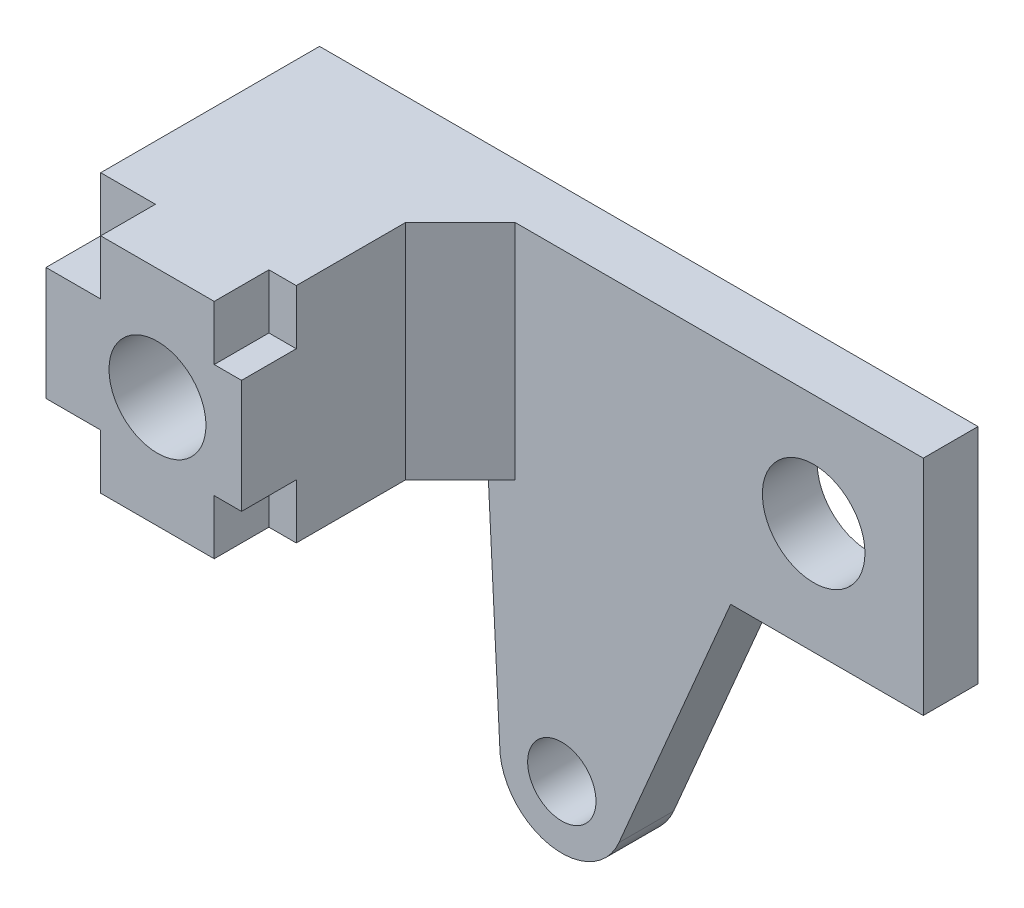
ISO-10303-21;
HEADER;
FILE_DESCRIPTION(('STEP AP214'),'2;1');
FILE_NAME('part.step','',(''),(''),'','','');
FILE_SCHEMA(('AUTOMOTIVE_DESIGN { 1 0 10303 214 1 1 1 1 }'));
ENDSEC;
DATA;
#1=APPLICATION_CONTEXT('core data for automotive mechanical design processes');
#2=APPLICATION_PROTOCOL_DEFINITION('international standard','automotive_design',2000,#1);
#3=PRODUCT_CONTEXT('',#1,'mechanical');
#4=PRODUCT('Part','Part','',(#3));
#5=PRODUCT_RELATED_PRODUCT_CATEGORY('part','',(#4));
#6=PRODUCT_DEFINITION_FORMATION('','',#4);
#7=PRODUCT_DEFINITION_CONTEXT('part definition',#1,'design');
#8=PRODUCT_DEFINITION('design','',#6,#7);
#9=PRODUCT_DEFINITION_SHAPE('','',#8);
#10=(LENGTH_UNIT() NAMED_UNIT(*) SI_UNIT(.MILLI.,.METRE.));
#11=(NAMED_UNIT(*) PLANE_ANGLE_UNIT() SI_UNIT($,.RADIAN.));
#12=(NAMED_UNIT(*) SI_UNIT($,.STERADIAN.) SOLID_ANGLE_UNIT());
#13=UNCERTAINTY_MEASURE_WITH_UNIT(LENGTH_MEASURE(1.E-05),#10,'distance_accuracy_value','');
#14=(GEOMETRIC_REPRESENTATION_CONTEXT(3) GLOBAL_UNCERTAINTY_ASSIGNED_CONTEXT((#13)) GLOBAL_UNIT_ASSIGNED_CONTEXT((#10,
#11,#12)) REPRESENTATION_CONTEXT('',''));
#15=CARTESIAN_POINT('',(0.,0.,0.));
#16=DIRECTION('',(0.,0.,1.));
#17=DIRECTION('',(1.,0.,0.));
#18=AXIS2_PLACEMENT_3D('',#15,#16,#17);
#19=CARTESIAN_POINT('',(0.,0.,-50.8));
#20=DIRECTION('',(0.,1.,0.));
#21=DIRECTION('',(0.,0.,-1.));
#22=AXIS2_PLACEMENT_3D('',#19,#20,#21);
#23=PLANE('',#22);
#24=DIRECTION('',(0.,0.,-1.));
#25=VECTOR('',#24,1.);
#26=CARTESIAN_POINT('',(20.701,0.,-45.72));
#27=LINE('',#26,#25);
#28=CARTESIAN_POINT('',(20.701,0.,-45.72));
#29=VERTEX_POINT('',#28);
#30=CARTESIAN_POINT('',(20.701,0.,-50.8));
#31=VERTEX_POINT('',#30);
#32=EDGE_CURVE('E277',#29,#31,#27,.T.);
#33=ORIENTED_EDGE('',*,*,#32,.F.);
#34=DIRECTION('',(-1.,0.,0.));
#35=VECTOR('',#34,1.);
#36=CARTESIAN_POINT('',(0.,0.,-45.72));
#37=LINE('',#36,#35);
#38=CARTESIAN_POINT('',(23.241,0.,-45.72));
#39=VERTEX_POINT('',#38);
#40=EDGE_CURVE('E46',#39,#29,#37,.T.);
#41=ORIENTED_EDGE('',*,*,#40,.F.);
#42=DIRECTION('',(0.707106781186548,0.,-0.707106781186548));
#43=VECTOR('',#42,1.);
#44=CARTESIAN_POINT('',(-11.2395,0.,-11.2395));
#45=LINE('',#44,#43);
#46=CARTESIAN_POINT('',(18.161,0.,-40.64));
#47=VERTEX_POINT('',#46);
#48=EDGE_CURVE('E280',#47,#39,#45,.T.);
#49=ORIENTED_EDGE('',*,*,#48,.F.);
#50=DIRECTION('',(0.,0.,-1.));
#51=VECTOR('',#50,1.);
#52=CARTESIAN_POINT('',(18.161,0.,-40.64));
#53=LINE('',#52,#51);
#54=CARTESIAN_POINT('',(18.161,0.,-30.48));
#55=VERTEX_POINT('',#54);
#56=EDGE_CURVE('E287',#55,#47,#53,.T.);
#57=ORIENTED_EDGE('',*,*,#56,.F.);
#58=DIRECTION('',(-1.,0.,0.));
#59=VECTOR('',#58,1.);
#60=CARTESIAN_POINT('',(20.701,0.,-30.48));
#61=LINE('',#60,#59);
#62=CARTESIAN_POINT('',(15.621,0.,-30.48));
#63=VERTEX_POINT('',#62);
#64=EDGE_CURVE('E345',#55,#63,#61,.T.);
#65=ORIENTED_EDGE('',*,*,#64,.T.);
#66=DIRECTION('',(0.,0.,1.));
#67=VECTOR('',#66,1.);
#68=CARTESIAN_POINT('',(15.621,0.,-30.48));
#69=LINE('',#68,#67);
#70=CARTESIAN_POINT('',(15.621,0.,-25.4));
#71=VERTEX_POINT('',#70);
#72=EDGE_CURVE('E339',#63,#71,#69,.T.);
#73=ORIENTED_EDGE('',*,*,#72,.T.);
#74=DIRECTION('',(1.,0.,0.));
#75=VECTOR('',#74,1.);
#76=CARTESIAN_POINT('',(0.,0.,-25.4));
#77=LINE('',#76,#75);
#78=CARTESIAN_POINT('',(5.08,0.,-25.4));
#79=VERTEX_POINT('',#78);
#80=EDGE_CURVE('E222',#79,#71,#77,.T.);
#81=ORIENTED_EDGE('',*,*,#80,.F.);
#82=DIRECTION('',(0.,0.,1.));
#83=VECTOR('',#82,1.);
#84=CARTESIAN_POINT('',(5.08,0.,-30.48));
#85=LINE('',#84,#83);
#86=CARTESIAN_POINT('',(5.08,0.,-30.48));
#87=VERTEX_POINT('',#86);
#88=EDGE_CURVE('E372',#87,#79,#85,.T.);
#89=ORIENTED_EDGE('',*,*,#88,.F.);
#90=DIRECTION('',(-1.,0.,0.));
#91=VECTOR('',#90,1.);
#92=CARTESIAN_POINT('',(0.,0.,-30.48));
#93=LINE('',#92,#91);
#94=CARTESIAN_POINT('',(0.,0.,-30.48));
#95=VERTEX_POINT('',#94);
#96=EDGE_CURVE('E369',#87,#95,#93,.T.);
#97=ORIENTED_EDGE('',*,*,#96,.T.);
#98=DIRECTION('',(0.,0.,1.));
#99=VECTOR('',#98,1.);
#100=CARTESIAN_POINT('',(0.,0.,-50.8));
#101=LINE('',#100,#99);
#102=CARTESIAN_POINT('',(0.,0.,-50.8));
#103=VERTEX_POINT('',#102);
#104=EDGE_CURVE('E225',#103,#95,#101,.T.);
#105=ORIENTED_EDGE('',*,*,#104,.F.);
#106=DIRECTION('',(1.,0.,0.));
#107=VECTOR('',#106,1.);
#108=CARTESIAN_POINT('',(0.,0.,-50.8));
#109=LINE('',#108,#107);
#110=EDGE_CURVE('E230',#103,#31,#109,.T.);
#111=ORIENTED_EDGE('',*,*,#110,.T.);
#112=EDGE_LOOP('',(#33,#41,#49,#57,#65,#73,#81,#89,#97,#105,#111));
#113=FACE_BOUND('',#112,.T.);
#114=ADVANCED_FACE('F38',(#113),#23,.F.);
#115=CARTESIAN_POINT('',(43.2595043201598,0.,-50.8));
#116=VERTEX_POINT('',#115);
#117=CARTESIAN_POINT('',(61.1505,0.,-50.8));
#118=VERTEX_POINT('',#117);
#119=EDGE_CURVE('E229',#116,#118,#109,.T.);
#120=ORIENTED_EDGE('',*,*,#119,.T.);
#121=DIRECTION('',(0.,0.,-1.));
#122=VECTOR('',#121,1.);
#123=CARTESIAN_POINT('',(61.1505,0.,-50.8));
#124=LINE('',#123,#122);
#125=CARTESIAN_POINT('',(61.1505,0.,-45.72));
#126=VERTEX_POINT('',#125);
#127=EDGE_CURVE('E194',#126,#118,#124,.T.);
#128=ORIENTED_EDGE('',*,*,#127,.F.);
#129=DIRECTION('',(-1.,0.,0.));
#130=VECTOR('',#129,1.);
#131=CARTESIAN_POINT('',(0.,0.,-45.72));
#132=LINE('',#131,#130);
#133=CARTESIAN_POINT('',(43.2595043201598,0.,-45.72));
#134=VERTEX_POINT('',#133);
#135=EDGE_CURVE('E233',#126,#134,#132,.T.);
#136=ORIENTED_EDGE('',*,*,#135,.T.);
#137=DIRECTION('',(0.,0.,-1.));
#138=VECTOR('',#137,1.);
#139=CARTESIAN_POINT('',(43.2595043201598,0.,-45.72));
#140=LINE('',#139,#138);
#141=EDGE_CURVE('E275',#134,#116,#140,.T.);
#142=ORIENTED_EDGE('',*,*,#141,.T.);
#143=EDGE_LOOP('',(#120,#128,#136,#142));
#144=FACE_BOUND('',#143,.T.);
#145=ADVANCED_FACE('F452',(#144),#23,.F.);
#146=CARTESIAN_POINT('',(0.,20.701,-50.8));
#147=DIRECTION('',(0.,1.,0.));
#148=DIRECTION('',(0.,0.,-1.));
#149=AXIS2_PLACEMENT_3D('',#146,#147,#148);
#150=PLANE('',#149);
#151=DIRECTION('',(0.,0.,-1.));
#152=VECTOR('',#151,1.);
#153=CARTESIAN_POINT('',(61.1505,20.701,-50.8));
#154=LINE('',#153,#152);
#155=CARTESIAN_POINT('',(61.1505,20.701,-45.72));
#156=VERTEX_POINT('',#155);
#157=CARTESIAN_POINT('',(61.1505,20.701,-50.8));
#158=VERTEX_POINT('',#157);
#159=EDGE_CURVE('E53',#156,#158,#154,.T.);
#160=ORIENTED_EDGE('',*,*,#159,.T.);
#161=DIRECTION('',(1.,0.,0.));
#162=VECTOR('',#161,1.);
#163=CARTESIAN_POINT('',(0.,20.701,-50.8));
#164=LINE('',#163,#162);
#165=CARTESIAN_POINT('',(0.,20.701,-50.8));
#166=VERTEX_POINT('',#165);
#167=EDGE_CURVE('E205',#166,#158,#164,.T.);
#168=ORIENTED_EDGE('',*,*,#167,.F.);
#169=DIRECTION('',(0.,0.,1.));
#170=VECTOR('',#169,1.);
#171=CARTESIAN_POINT('',(0.,20.701,-50.8));
#172=LINE('',#171,#170);
#173=CARTESIAN_POINT('',(0.,20.701,-30.48));
#174=VERTEX_POINT('',#173);
#175=EDGE_CURVE('E215',#166,#174,#172,.T.);
#176=ORIENTED_EDGE('',*,*,#175,.T.);
#177=DIRECTION('',(1.,0.,0.));
#178=VECTOR('',#177,1.);
#179=CARTESIAN_POINT('',(0.,20.701,-30.48));
#180=LINE('',#179,#178);
#181=CARTESIAN_POINT('',(5.08,20.701,-30.48));
#182=VERTEX_POINT('',#181);
#183=EDGE_CURVE('E307',#174,#182,#180,.T.);
#184=ORIENTED_EDGE('',*,*,#183,.T.);
#185=DIRECTION('',(0.,0.,1.));
#186=VECTOR('',#185,1.);
#187=CARTESIAN_POINT('',(5.08,20.701,-30.48));
#188=LINE('',#187,#186);
#189=CARTESIAN_POINT('',(5.08,20.701,-25.4));
#190=VERTEX_POINT('',#189);
#191=EDGE_CURVE('E325',#182,#190,#188,.T.);
#192=ORIENTED_EDGE('',*,*,#191,.T.);
#193=DIRECTION('',(1.,0.,0.));
#194=VECTOR('',#193,1.);
#195=CARTESIAN_POINT('',(0.,20.701,-25.4));
#196=LINE('',#195,#194);
#197=CARTESIAN_POINT('',(15.621,20.701,-25.4));
#198=VERTEX_POINT('',#197);
#199=EDGE_CURVE('E218',#190,#198,#196,.T.);
#200=ORIENTED_EDGE('',*,*,#199,.T.);
#201=DIRECTION('',(0.,0.,1.));
#202=VECTOR('',#201,1.);
#203=CARTESIAN_POINT('',(15.621,20.701,-30.48));
#204=LINE('',#203,#202);
#205=CARTESIAN_POINT('',(15.621,20.701,-30.48));
#206=VERTEX_POINT('',#205);
#207=EDGE_CURVE('E336',#206,#198,#204,.T.);
#208=ORIENTED_EDGE('',*,*,#207,.F.);
#209=DIRECTION('',(1.,0.,0.));
#210=VECTOR('',#209,1.);
#211=CARTESIAN_POINT('',(20.701,20.701,-30.48));
#212=LINE('',#211,#210);
#213=CARTESIAN_POINT('',(18.161,20.701,-30.48));
#214=VERTEX_POINT('',#213);
#215=EDGE_CURVE('E334',#206,#214,#212,.T.);
#216=ORIENTED_EDGE('',*,*,#215,.T.);
#217=DIRECTION('',(0.,0.,-1.));
#218=VECTOR('',#217,1.);
#219=CARTESIAN_POINT('',(18.161,20.701,-40.64));
#220=LINE('',#219,#218);
#221=CARTESIAN_POINT('',(18.161,20.701,-40.64));
#222=VERTEX_POINT('',#221);
#223=EDGE_CURVE('E288',#214,#222,#220,.T.);
#224=ORIENTED_EDGE('',*,*,#223,.T.);
#225=DIRECTION('',(0.707106781186548,0.,-0.707106781186548));
#226=VECTOR('',#225,1.);
#227=CARTESIAN_POINT('',(-11.2395,20.701,-11.2395));
#228=LINE('',#227,#226);
#229=CARTESIAN_POINT('',(23.241,20.701,-45.72));
#230=VERTEX_POINT('',#229);
#231=EDGE_CURVE('E274',#222,#230,#228,.T.);
#232=ORIENTED_EDGE('',*,*,#231,.T.);
#233=DIRECTION('',(-1.,0.,0.));
#234=VECTOR('',#233,1.);
#235=CARTESIAN_POINT('',(0.,20.701,-45.72));
#236=LINE('',#235,#234);
#237=EDGE_CURVE('E208',#156,#230,#236,.T.);
#238=ORIENTED_EDGE('',*,*,#237,.F.);
#239=EDGE_LOOP('',(#160,#168,#176,#184,#192,#200,#208,#216,#224,#232,#238));
#240=FACE_BOUND('',#239,.T.);
#241=ADVANCED_FACE('F203',(#240),#150,.T.);
#242=CARTESIAN_POINT('',(0.,20.701,-25.4));
#243=DIRECTION('',(0.,0.,1.));
#244=DIRECTION('',(-1.,0.,0.));
#245=AXIS2_PLACEMENT_3D('',#242,#243,#244);
#246=PLANE('',#245);
#247=DIRECTION('',(0.,-1.,0.));
#248=VECTOR('',#247,1.);
#249=CARTESIAN_POINT('',(18.161,20.701,-25.4));
#250=LINE('',#249,#248);
#251=CARTESIAN_POINT('',(18.161,15.621,-25.4));
#252=VERTEX_POINT('',#251);
#253=CARTESIAN_POINT('',(18.161,5.08,-25.4));
#254=VERTEX_POINT('',#253);
#255=EDGE_CURVE('E297',#252,#254,#250,.T.);
#256=ORIENTED_EDGE('',*,*,#255,.F.);
#257=DIRECTION('',(-1.,0.,0.));
#258=VECTOR('',#257,1.);
#259=CARTESIAN_POINT('',(20.701,15.621,-25.4));
#260=LINE('',#259,#258);
#261=CARTESIAN_POINT('',(15.621,15.621,-25.4));
#262=VERTEX_POINT('',#261);
#263=EDGE_CURVE('E337',#252,#262,#260,.T.);
#264=ORIENTED_EDGE('',*,*,#263,.T.);
#265=DIRECTION('',(0.,1.,0.));
#266=VECTOR('',#265,1.);
#267=CARTESIAN_POINT('',(15.621,20.701,-25.4));
#268=LINE('',#267,#266);
#269=EDGE_CURVE('E332',#262,#198,#268,.T.);
#270=ORIENTED_EDGE('',*,*,#269,.T.);
#271=ORIENTED_EDGE('',*,*,#199,.F.);
#272=DIRECTION('',(0.,-1.,0.));
#273=VECTOR('',#272,1.);
#274=CARTESIAN_POINT('',(5.08,20.701,-25.4));
#275=LINE('',#274,#273);
#276=CARTESIAN_POINT('',(5.08,15.621,-25.4));
#277=VERTEX_POINT('',#276);
#278=EDGE_CURVE('E316',#190,#277,#275,.T.);
#279=ORIENTED_EDGE('',*,*,#278,.T.);
#280=DIRECTION('',(-1.,0.,0.));
#281=VECTOR('',#280,1.);
#282=CARTESIAN_POINT('',(0.,15.621,-25.4));
#283=LINE('',#282,#281);
#284=CARTESIAN_POINT('',(0.,15.621,-25.4));
#285=VERTEX_POINT('',#284);
#286=EDGE_CURVE('E308',#277,#285,#283,.T.);
#287=ORIENTED_EDGE('',*,*,#286,.T.);
#288=DIRECTION('',(0.,-1.,0.));
#289=VECTOR('',#288,1.);
#290=CARTESIAN_POINT('',(0.,20.701,-25.4));
#291=LINE('',#290,#289);
#292=CARTESIAN_POINT('',(0.,5.08,-25.4));
#293=VERTEX_POINT('',#292);
#294=EDGE_CURVE('E236',#285,#293,#291,.T.);
#295=ORIENTED_EDGE('',*,*,#294,.T.);
#296=DIRECTION('',(1.,0.,0.));
#297=VECTOR('',#296,1.);
#298=CARTESIAN_POINT('',(0.,5.08,-25.4));
#299=LINE('',#298,#297);
#300=CARTESIAN_POINT('',(5.08,5.08,-25.4));
#301=VERTEX_POINT('',#300);
#302=EDGE_CURVE('E328',#293,#301,#299,.T.);
#303=ORIENTED_EDGE('',*,*,#302,.T.);
#304=DIRECTION('',(0.,-1.,0.));
#305=VECTOR('',#304,1.);
#306=CARTESIAN_POINT('',(5.08,0.,-25.4));
#307=LINE('',#306,#305);
#308=EDGE_CURVE('E365',#301,#79,#307,.T.);
#309=ORIENTED_EDGE('',*,*,#308,.T.);
#310=ORIENTED_EDGE('',*,*,#80,.T.);
#311=DIRECTION('',(0.,1.,0.));
#312=VECTOR('',#311,1.);
#313=CARTESIAN_POINT('',(15.621,0.,-25.4));
#314=LINE('',#313,#312);
#315=CARTESIAN_POINT('',(15.621,5.08,-25.4));
#316=VERTEX_POINT('',#315);
#317=EDGE_CURVE('E303',#71,#316,#314,.T.);
#318=ORIENTED_EDGE('',*,*,#317,.T.);
#319=DIRECTION('',(1.,0.,0.));
#320=VECTOR('',#319,1.);
#321=CARTESIAN_POINT('',(20.701,5.08,-25.4));
#322=LINE('',#321,#320);
#323=EDGE_CURVE('E348',#316,#254,#322,.T.);
#324=ORIENTED_EDGE('',*,*,#323,.T.);
#325=EDGE_LOOP('',(#256,#264,#270,#271,#279,#287,#295,#303,#309,#310,#318,#324));
#326=FACE_BOUND('',#325,.T.);
#327=CARTESIAN_POINT('',(10.3505,10.3505,-25.4));
#328=DIRECTION('',(0.,0.,-1.));
#329=DIRECTION('',(-1.,0.,0.));
#330=AXIS2_PLACEMENT_3D('',#327,#328,#329);
#331=CIRCLE('',#330,4.5);
#332=CARTESIAN_POINT('',(5.8505,10.3505,-25.4));
#333=VERTEX_POINT('',#332);
#334=EDGE_CURVE('E242',#333,#333,#331,.T.);
#335=ORIENTED_EDGE('',*,*,#334,.T.);
#336=EDGE_LOOP('',(#335));
#337=FACE_BOUND('',#336,.T.);
#338=ADVANCED_FACE('F40',(#326,#337),#246,.T.);
#339=CARTESIAN_POINT('',(0.,20.701,-50.8));
#340=DIRECTION('',(-1.,0.,0.));
#341=DIRECTION('',(0.,0.,-1.));
#342=AXIS2_PLACEMENT_3D('',#339,#340,#341);
#343=PLANE('',#342);
#344=ORIENTED_EDGE('',*,*,#294,.F.);
#345=DIRECTION('',(0.,0.,1.));
#346=VECTOR('',#345,1.);
#347=CARTESIAN_POINT('',(0.,15.621,-30.48));
#348=LINE('',#347,#346);
#349=CARTESIAN_POINT('',(0.,15.621,-30.48));
#350=VERTEX_POINT('',#349);
#351=EDGE_CURVE('E315',#350,#285,#348,.T.);
#352=ORIENTED_EDGE('',*,*,#351,.F.);
#353=DIRECTION('',(0.,1.,0.));
#354=VECTOR('',#353,1.);
#355=CARTESIAN_POINT('',(0.,20.701,-30.48));
#356=LINE('',#355,#354);
#357=EDGE_CURVE('E304',#350,#174,#356,.T.);
#358=ORIENTED_EDGE('',*,*,#357,.T.);
#359=ORIENTED_EDGE('',*,*,#175,.F.);
#360=DIRECTION('',(0.,-1.,0.));
#361=VECTOR('',#360,1.);
#362=CARTESIAN_POINT('',(0.,20.701,-50.8));
#363=LINE('',#362,#361);
#364=EDGE_CURVE('E213',#166,#103,#363,.T.);
#365=ORIENTED_EDGE('',*,*,#364,.T.);
#366=ORIENTED_EDGE('',*,*,#104,.T.);
#367=DIRECTION('',(0.,1.,0.));
#368=VECTOR('',#367,1.);
#369=CARTESIAN_POINT('',(0.,0.,-30.48));
#370=LINE('',#369,#368);
#371=CARTESIAN_POINT('',(0.,5.08,-30.48));
#372=VERTEX_POINT('',#371);
#373=EDGE_CURVE('E361',#95,#372,#370,.T.);
#374=ORIENTED_EDGE('',*,*,#373,.T.);
#375=DIRECTION('',(0.,0.,1.));
#376=VECTOR('',#375,1.);
#377=CARTESIAN_POINT('',(0.,5.08,-30.48));
#378=LINE('',#377,#376);
#379=EDGE_CURVE('E380',#372,#293,#378,.T.);
#380=ORIENTED_EDGE('',*,*,#379,.T.);
#381=EDGE_LOOP('',(#344,#352,#358,#359,#365,#366,#374,#380));
#382=FACE_BOUND('',#381,.T.);
#383=ADVANCED_FACE('F443',(#382),#343,.T.);
#384=CARTESIAN_POINT('',(0.,20.701,-50.8));
#385=DIRECTION('',(0.,0.,1.));
#386=DIRECTION('',(-1.,0.,0.));
#387=AXIS2_PLACEMENT_3D('',#384,#385,#386);
#388=PLANE('',#387);
#389=CARTESIAN_POINT('',(50.970999912,10.3505,-50.8));
#390=DIRECTION('',(0.,0.,1.));
#391=DIRECTION('',(1.,0.,0.));
#392=AXIS2_PLACEMENT_3D('',#389,#390,#391);
#393=CIRCLE('',#392,4.7625);
#394=CARTESIAN_POINT('',(55.733499912,10.3505,-50.8));
#395=VERTEX_POINT('',#394);
#396=EDGE_CURVE('E243',#395,#395,#393,.T.);
#397=ORIENTED_EDGE('',*,*,#396,.T.);
#398=EDGE_LOOP('',(#397));
#399=FACE_BOUND('',#398,.T.);
#400=CARTESIAN_POINT('',(10.3505,10.3505,-50.8));
#401=DIRECTION('',(0.,0.,-1.));
#402=DIRECTION('',(-1.,0.,0.));
#403=AXIS2_PLACEMENT_3D('',#400,#401,#402);
#404=CIRCLE('',#403,4.5);
#405=CARTESIAN_POINT('',(5.8505,10.3505,-50.8));
#406=VERTEX_POINT('',#405);
#407=EDGE_CURVE('E226',#406,#406,#404,.T.);
#408=ORIENTED_EDGE('',*,*,#407,.F.);
#409=EDGE_LOOP('',(#408));
#410=FACE_BOUND('',#409,.T.);
#411=ORIENTED_EDGE('',*,*,#167,.T.);
#412=DIRECTION('',(0.,-1.,0.));
#413=VECTOR('',#412,1.);
#414=CARTESIAN_POINT('',(61.1505,20.701,-50.8));
#415=LINE('',#414,#413);
#416=EDGE_CURVE('E191',#158,#118,#415,.T.);
#417=ORIENTED_EDGE('',*,*,#416,.T.);
#418=ORIENTED_EDGE('',*,*,#119,.F.);
#419=DIRECTION('',(0.391880007881832,0.920016336497638,0.));
#420=VECTOR('',#419,1.);
#421=CARTESIAN_POINT('',(36.6161448123023,-15.5966090474787,-50.8));
#422=LINE('',#421,#420);
#423=CARTESIAN_POINT('',(32.8846235947898,-24.3570980008583,-50.8));
#424=VERTEX_POINT('',#423);
#425=EDGE_CURVE('E60',#424,#116,#422,.T.);
#426=ORIENTED_EDGE('',*,*,#425,.F.);
#427=CARTESIAN_POINT('',(27.580941282,-22.098,-50.8));
#428=DIRECTION('',(0.,0.,-1.));
#429=DIRECTION('',(-1.,0.,0.));
#430=AXIS2_PLACEMENT_3D('',#427,#428,#429);
#431=CIRCLE('',#430,5.76476971374234);
#432=CARTESIAN_POINT('',(21.8161715682577,-22.098,-50.8));
#433=VERTEX_POINT('',#432);
#434=EDGE_CURVE('E264',#433,#424,#431,.F.);
#435=ORIENTED_EDGE('',*,*,#434,.F.);
#436=DIRECTION('',(-0.0504006820608477,0.998729078002539,0.));
#437=VECTOR('',#436,1.);
#438=CARTESIAN_POINT('',(20.6484147246007,1.04201850984105,-50.8));
#439=LINE('',#438,#437);
#440=EDGE_CURVE('E267',#433,#31,#439,.T.);
#441=ORIENTED_EDGE('',*,*,#440,.T.);
#442=ORIENTED_EDGE('',*,*,#110,.F.);
#443=ORIENTED_EDGE('',*,*,#364,.F.);
#444=EDGE_LOOP('',(#411,#417,#418,#426,#435,#441,#442,#443));
#445=FACE_BOUND('',#444,.T.);
#446=CARTESIAN_POINT('',(27.580941282,-22.098,-50.8));
#447=DIRECTION('',(0.,0.,-1.));
#448=DIRECTION('',(-1.,0.,0.));
#449=AXIS2_PLACEMENT_3D('',#446,#447,#448);
#450=CIRCLE('',#449,3.175);
#451=CARTESIAN_POINT('',(24.405941282,-22.098,-50.8));
#452=VERTEX_POINT('',#451);
#453=EDGE_CURVE('E199',#452,#452,#450,.T.);
#454=ORIENTED_EDGE('',*,*,#453,.F.);
#455=EDGE_LOOP('',(#454));
#456=FACE_BOUND('',#455,.T.);
#457=ADVANCED_FACE('F210',(#399,#410,#445,#456),#388,.F.);
#458=CARTESIAN_POINT('',(0.,20.701,-45.72));
#459=DIRECTION('',(0.,0.,-1.));
#460=DIRECTION('',(1.,0.,0.));
#461=AXIS2_PLACEMENT_3D('',#458,#459,#460);
#462=PLANE('',#461);
#463=CARTESIAN_POINT('',(50.970999912,10.3505,-45.72));
#464=DIRECTION('',(0.,0.,1.));
#465=DIRECTION('',(1.,0.,0.));
#466=AXIS2_PLACEMENT_3D('',#463,#464,#465);
#467=CIRCLE('',#466,4.7625);
#468=CARTESIAN_POINT('',(55.733499912,10.3505,-45.72));
#469=VERTEX_POINT('',#468);
#470=EDGE_CURVE('E240',#469,#469,#467,.T.);
#471=ORIENTED_EDGE('',*,*,#470,.F.);
#472=EDGE_LOOP('',(#471));
#473=FACE_BOUND('',#472,.T.);
#474=ORIENTED_EDGE('',*,*,#135,.F.);
#475=DIRECTION('',(0.,1.,0.));
#476=VECTOR('',#475,1.);
#477=CARTESIAN_POINT('',(61.1505,20.701,-45.72));
#478=LINE('',#477,#476);
#479=EDGE_CURVE('E11',#126,#156,#478,.T.);
#480=ORIENTED_EDGE('',*,*,#479,.T.);
#481=ORIENTED_EDGE('',*,*,#237,.T.);
#482=DIRECTION('',(0.,1.,0.));
#483=VECTOR('',#482,1.);
#484=CARTESIAN_POINT('',(23.241,0.,-45.72));
#485=LINE('',#484,#483);
#486=EDGE_CURVE('E283',#39,#230,#485,.T.);
#487=ORIENTED_EDGE('',*,*,#486,.F.);
#488=ORIENTED_EDGE('',*,*,#40,.T.);
#489=DIRECTION('',(-0.0504006820608477,0.998729078002539,0.));
#490=VECTOR('',#489,1.);
#491=CARTESIAN_POINT('',(20.6484147246007,1.04201850984105,-45.72));
#492=LINE('',#491,#490);
#493=CARTESIAN_POINT('',(21.8161715682577,-22.098,-45.72));
#494=VERTEX_POINT('',#493);
#495=EDGE_CURVE('E256',#494,#29,#492,.T.);
#496=ORIENTED_EDGE('',*,*,#495,.F.);
#497=CARTESIAN_POINT('',(27.580941282,-22.098,-45.72));
#498=DIRECTION('',(0.,0.,-1.));
#499=DIRECTION('',(-1.,0.,0.));
#500=AXIS2_PLACEMENT_3D('',#497,#498,#499);
#501=CIRCLE('',#500,5.76476971374234);
#502=CARTESIAN_POINT('',(32.8846235947898,-24.3570980008583,-45.72));
#503=VERTEX_POINT('',#502);
#504=EDGE_CURVE('E423',#494,#503,#501,.F.);
#505=ORIENTED_EDGE('',*,*,#504,.T.);
#506=DIRECTION('',(0.391880007881832,0.920016336497638,0.));
#507=VECTOR('',#506,1.);
#508=CARTESIAN_POINT('',(36.6161448123023,-15.5966090474787,-45.72));
#509=LINE('',#508,#507);
#510=EDGE_CURVE('E258',#503,#134,#509,.T.);
#511=ORIENTED_EDGE('',*,*,#510,.T.);
#512=EDGE_LOOP('',(#474,#480,#481,#487,#488,#496,#505,#511));
#513=FACE_BOUND('',#512,.T.);
#514=CARTESIAN_POINT('',(27.580941282,-22.098,-45.72));
#515=DIRECTION('',(0.,0.,-1.));
#516=DIRECTION('',(-1.,0.,0.));
#517=AXIS2_PLACEMENT_3D('',#514,#515,#516);
#518=CIRCLE('',#517,3.175);
#519=CARTESIAN_POINT('',(24.405941282,-22.098,-45.72));
#520=VERTEX_POINT('',#519);
#521=EDGE_CURVE('E271',#520,#520,#518,.T.);
#522=ORIENTED_EDGE('',*,*,#521,.T.);
#523=EDGE_LOOP('',(#522));
#524=FACE_BOUND('',#523,.T.);
#525=ADVANCED_FACE('F425',(#473,#513,#524),#462,.F.);
#526=CARTESIAN_POINT('',(10.3505,10.3505,-50.8));
#527=DIRECTION('',(0.,0.,1.));
#528=DIRECTION('',(-1.,0.,0.));
#529=AXIS2_PLACEMENT_3D('',#526,#527,#528);
#530=CYLINDRICAL_SURFACE('',#529,4.5);
#531=CARTESIAN_POINT('',(5.8505,10.3505,-50.8));
#532=CARTESIAN_POINT('',(5.8505,10.3505,-50.5354166666667));
#533=CARTESIAN_POINT('',(5.8505,10.3505,-50.2708333333333));
#534=CARTESIAN_POINT('',(5.8505,10.3505,-49.7416666666667));
#535=CARTESIAN_POINT('',(5.8505,10.3505,-49.4770833333333));
#536=CARTESIAN_POINT('',(5.8505,10.3505,-48.9479166666667));
#537=CARTESIAN_POINT('',(5.8505,10.3505,-48.6833333333333));
#538=CARTESIAN_POINT('',(5.8505,10.3505,-48.1541666666667));
#539=CARTESIAN_POINT('',(5.8505,10.3505,-47.8895833333333));
#540=CARTESIAN_POINT('',(5.8505,10.3505,-47.3604166666667));
#541=CARTESIAN_POINT('',(5.8505,10.3505,-47.0958333333333));
#542=CARTESIAN_POINT('',(5.8505,10.3505,-46.5666666666667));
#543=CARTESIAN_POINT('',(5.8505,10.3505,-46.3020833333333));
#544=CARTESIAN_POINT('',(5.8505,10.3505,-45.7729166666667));
#545=CARTESIAN_POINT('',(5.8505,10.3505,-45.5083333333333));
#546=CARTESIAN_POINT('',(5.8505,10.3505,-44.9791666666667));
#547=CARTESIAN_POINT('',(5.8505,10.3505,-44.7145833333333));
#548=CARTESIAN_POINT('',(5.8505,10.3505,-44.1854166666667));
#549=CARTESIAN_POINT('',(5.8505,10.3505,-43.9208333333333));
#550=CARTESIAN_POINT('',(5.8505,10.3505,-43.3916666666667));
#551=CARTESIAN_POINT('',(5.8505,10.3505,-43.1270833333333));
#552=CARTESIAN_POINT('',(5.8505,10.3505,-42.5979166666667));
#553=CARTESIAN_POINT('',(5.8505,10.3505,-42.3333333333333));
#554=CARTESIAN_POINT('',(5.8505,10.3505,-41.8041666666667));
#555=CARTESIAN_POINT('',(5.8505,10.3505,-41.5395833333333));
#556=CARTESIAN_POINT('',(5.8505,10.3505,-41.0104166666667));
#557=CARTESIAN_POINT('',(5.8505,10.3505,-40.7458333333333));
#558=CARTESIAN_POINT('',(5.8505,10.3505,-40.2166666666667));
#559=CARTESIAN_POINT('',(5.8505,10.3505,-39.9520833333333));
#560=CARTESIAN_POINT('',(5.8505,10.3505,-39.4229166666667));
#561=CARTESIAN_POINT('',(5.8505,10.3505,-39.1583333333333));
#562=CARTESIAN_POINT('',(5.8505,10.3505,-38.6291666666667));
#563=CARTESIAN_POINT('',(5.8505,10.3505,-38.3645833333333));
#564=CARTESIAN_POINT('',(5.8505,10.3505,-37.8354166666667));
#565=CARTESIAN_POINT('',(5.8505,10.3505,-37.5708333333333));
#566=CARTESIAN_POINT('',(5.8505,10.3505,-37.0416666666667));
#567=CARTESIAN_POINT('',(5.8505,10.3505,-36.7770833333333));
#568=CARTESIAN_POINT('',(5.8505,10.3505,-36.2479166666667));
#569=CARTESIAN_POINT('',(5.8505,10.3505,-35.9833333333333));
#570=CARTESIAN_POINT('',(5.8505,10.3505,-35.4541666666667));
#571=CARTESIAN_POINT('',(5.8505,10.3505,-35.1895833333333));
#572=CARTESIAN_POINT('',(5.8505,10.3505,-34.6604166666667));
#573=CARTESIAN_POINT('',(5.8505,10.3505,-34.3958333333333));
#574=CARTESIAN_POINT('',(5.8505,10.3505,-33.8666666666667));
#575=CARTESIAN_POINT('',(5.8505,10.3505,-33.6020833333333));
#576=CARTESIAN_POINT('',(5.8505,10.3505,-33.0729166666667));
#577=CARTESIAN_POINT('',(5.8505,10.3505,-32.8083333333333));
#578=CARTESIAN_POINT('',(5.8505,10.3505,-32.2791666666667));
#579=CARTESIAN_POINT('',(5.8505,10.3505,-32.0145833333333));
#580=CARTESIAN_POINT('',(5.8505,10.3505,-31.4854166666667));
#581=CARTESIAN_POINT('',(5.8505,10.3505,-31.2208333333333));
#582=CARTESIAN_POINT('',(5.8505,10.3505,-30.6916666666667));
#583=CARTESIAN_POINT('',(5.8505,10.3505,-30.4270833333333));
#584=CARTESIAN_POINT('',(5.8505,10.3505,-29.8979166666667));
#585=CARTESIAN_POINT('',(5.8505,10.3505,-29.6333333333333));
#586=CARTESIAN_POINT('',(5.8505,10.3505,-29.1041666666667));
#587=CARTESIAN_POINT('',(5.8505,10.3505,-28.8395833333333));
#588=CARTESIAN_POINT('',(5.8505,10.3505,-28.3104166666667));
#589=CARTESIAN_POINT('',(5.8505,10.3505,-28.0458333333333));
#590=CARTESIAN_POINT('',(5.8505,10.3505,-27.5166666666667));
#591=CARTESIAN_POINT('',(5.8505,10.3505,-27.2520833333333));
#592=CARTESIAN_POINT('',(5.8505,10.3505,-26.7229166666667));
#593=CARTESIAN_POINT('',(5.8505,10.3505,-26.4583333333333));
#594=CARTESIAN_POINT('',(5.8505,10.3505,-25.9291666666667));
#595=CARTESIAN_POINT('',(5.8505,10.3505,-25.6645833333333));
#596=CARTESIAN_POINT('',(5.8505,10.3505,-25.4));
#597=B_SPLINE_CURVE_WITH_KNOTS('',3,(#531,#532,#533,#534,#535,#536,#537,#538,#539,#540,#541,
#542,#543,#544,#545,#546,#547,#548,#549,#550,#551,#552,#553,#554,#555,#556,#557,#558,#559,#560,
#561,#562,#563,#564,#565,#566,#567,#568,#569,#570,#571,#572,#573,#574,#575,#576,#577,#578,#579,
#580,#581,#582,#583,#584,#585,#586,#587,#588,#589,#590,#591,#592,#593,#594,#595,#596),
.UNSPECIFIED.,.F.,.F.,(4,2,2,2,2,2,2,2,2,2,2,2,2,2,2,2,2,2,2,2,2,2,2,2,2,2,2,2,2,2,2,2,4),(0.,
0.793750000000003,1.58750000000001,2.38125,3.175,3.96875,4.7625,5.55625000000001,6.35,7.14375,
7.9375,8.73125,9.525,10.31875,11.1125,11.90625,12.7,13.49375,14.2875,15.08125,15.875,16.66875,
17.4625,18.25625,19.05,19.84375,20.6375,21.43125,22.225,23.01875,23.8125,24.60625,25.4),.UNSPECIFIED.);
#598=EDGE_CURVE('BSEAM428',#406,#333,#597,.T.);
#599=ORIENTED_EDGE('',*,*,#407,.T.);
#600=ORIENTED_EDGE('',*,*,#334,.F.);
#601=ORIENTED_EDGE('',*,*,#598,.T.);
#602=ORIENTED_EDGE('',*,*,#598,.F.);
#603=EDGE_LOOP('',(#599,#601,#600,#602));
#604=FACE_BOUND('',#603,.T.);
#605=ADVANCED_FACE('F428',(#604),#530,.F.);
#606=CARTESIAN_POINT('',(50.970999912,10.3505,-38.1));
#607=DIRECTION('',(0.,0.,-1.));
#608=DIRECTION('',(1.,0.,0.));
#609=AXIS2_PLACEMENT_3D('',#606,#607,#608);
#610=CYLINDRICAL_SURFACE('',#609,4.7625);
#611=ORIENTED_EDGE('',*,*,#396,.F.);
#612=EDGE_LOOP('',(#611));
#613=FACE_BOUND('',#612,.T.);
#614=ORIENTED_EDGE('',*,*,#470,.T.);
#615=EDGE_LOOP('',(#614));
#616=FACE_BOUND('',#615,.T.);
#617=ADVANCED_FACE('F463',(#613,#616),#610,.F.);
#618=CARTESIAN_POINT('',(0.,5.08,-30.48));
#619=DIRECTION('',(0.,-1.,0.));
#620=DIRECTION('',(0.,0.,-1.));
#621=AXIS2_PLACEMENT_3D('',#618,#619,#620);
#622=PLANE('',#621);
#623=ORIENTED_EDGE('',*,*,#302,.F.);
#624=ORIENTED_EDGE('',*,*,#379,.F.);
#625=DIRECTION('',(1.,0.,0.));
#626=VECTOR('',#625,1.);
#627=CARTESIAN_POINT('',(0.,5.08,-30.48));
#628=LINE('',#627,#626);
#629=CARTESIAN_POINT('',(5.08,5.08,-30.48));
#630=VERTEX_POINT('',#629);
#631=EDGE_CURVE('E364',#372,#630,#628,.T.);
#632=ORIENTED_EDGE('',*,*,#631,.T.);
#633=DIRECTION('',(0.,0.,1.));
#634=VECTOR('',#633,1.);
#635=CARTESIAN_POINT('',(5.08,5.08,-30.48));
#636=LINE('',#635,#634);
#637=EDGE_CURVE('E378',#630,#301,#636,.T.);
#638=ORIENTED_EDGE('',*,*,#637,.T.);
#639=EDGE_LOOP('',(#623,#624,#632,#638));
#640=FACE_BOUND('',#639,.T.);
#641=ADVANCED_FACE('F467',(#640),#622,.T.);
#642=CARTESIAN_POINT('',(5.08,0.,-30.48));
#643=DIRECTION('',(-1.,0.,0.));
#644=DIRECTION('',(0.,0.,1.));
#645=AXIS2_PLACEMENT_3D('',#642,#643,#644);
#646=PLANE('',#645);
#647=ORIENTED_EDGE('',*,*,#308,.F.);
#648=ORIENTED_EDGE('',*,*,#637,.F.);
#649=DIRECTION('',(0.,-1.,0.));
#650=VECTOR('',#649,1.);
#651=CARTESIAN_POINT('',(5.08,0.,-30.48));
#652=LINE('',#651,#650);
#653=EDGE_CURVE('E367',#630,#87,#652,.T.);
#654=ORIENTED_EDGE('',*,*,#653,.T.);
#655=ORIENTED_EDGE('',*,*,#88,.T.);
#656=EDGE_LOOP('',(#647,#648,#654,#655));
#657=FACE_BOUND('',#656,.T.);
#658=ADVANCED_FACE('F471',(#657),#646,.T.);
#659=CARTESIAN_POINT('',(0.,0.,-30.48));
#660=DIRECTION('',(0.,0.,-1.));
#661=DIRECTION('',(-1.,0.,0.));
#662=AXIS2_PLACEMENT_3D('',#659,#660,#661);
#663=PLANE('',#662);
#664=ORIENTED_EDGE('',*,*,#373,.F.);
#665=ORIENTED_EDGE('',*,*,#96,.F.);
#666=ORIENTED_EDGE('',*,*,#653,.F.);
#667=ORIENTED_EDGE('',*,*,#631,.F.);
#668=EDGE_LOOP('',(#664,#665,#666,#667));
#669=FACE_BOUND('',#668,.T.);
#670=ADVANCED_FACE('F475',(#669),#663,.F.);
#671=CARTESIAN_POINT('',(15.621,0.,-30.48));
#672=DIRECTION('',(1.,0.,0.));
#673=DIRECTION('',(0.,0.,-1.));
#674=AXIS2_PLACEMENT_3D('',#671,#672,#673);
#675=PLANE('',#674);
#676=ORIENTED_EDGE('',*,*,#317,.F.);
#677=ORIENTED_EDGE('',*,*,#72,.F.);
#678=DIRECTION('',(0.,1.,0.));
#679=VECTOR('',#678,1.);
#680=CARTESIAN_POINT('',(15.621,0.,-30.48));
#681=LINE('',#680,#679);
#682=CARTESIAN_POINT('',(15.621,5.08,-30.48));
#683=VERTEX_POINT('',#682);
#684=EDGE_CURVE('E347',#63,#683,#681,.T.);
#685=ORIENTED_EDGE('',*,*,#684,.T.);
#686=DIRECTION('',(0.,0.,1.));
#687=VECTOR('',#686,1.);
#688=CARTESIAN_POINT('',(15.621,5.08,-30.48));
#689=LINE('',#688,#687);
#690=EDGE_CURVE('E353',#683,#316,#689,.T.);
#691=ORIENTED_EDGE('',*,*,#690,.T.);
#692=EDGE_LOOP('',(#676,#677,#685,#691));
#693=FACE_BOUND('',#692,.T.);
#694=ADVANCED_FACE('F479',(#693),#675,.T.);
#695=CARTESIAN_POINT('',(20.701,5.08,-30.48));
#696=DIRECTION('',(0.,-1.,0.));
#697=DIRECTION('',(0.,0.,-1.));
#698=AXIS2_PLACEMENT_3D('',#695,#696,#697);
#699=PLANE('',#698);
#700=DIRECTION('',(0.,0.,-1.));
#701=VECTOR('',#700,1.);
#702=CARTESIAN_POINT('',(18.161,5.08,-30.48));
#703=LINE('',#702,#701);
#704=CARTESIAN_POINT('',(18.161,5.08,-30.48));
#705=VERTEX_POINT('',#704);
#706=EDGE_CURVE('E299',#254,#705,#703,.T.);
#707=ORIENTED_EDGE('',*,*,#706,.F.);
#708=ORIENTED_EDGE('',*,*,#323,.F.);
#709=ORIENTED_EDGE('',*,*,#690,.F.);
#710=DIRECTION('',(1.,0.,0.));
#711=VECTOR('',#710,1.);
#712=CARTESIAN_POINT('',(20.701,5.08,-30.48));
#713=LINE('',#712,#711);
#714=EDGE_CURVE('E350',#683,#705,#713,.T.);
#715=ORIENTED_EDGE('',*,*,#714,.T.);
#716=EDGE_LOOP('',(#707,#708,#709,#715));
#717=FACE_BOUND('',#716,.T.);
#718=ADVANCED_FACE('F483',(#717),#699,.T.);
#719=CARTESIAN_POINT('',(0.,0.,-30.48));
#720=DIRECTION('',(0.,0.,1.));
#721=DIRECTION('',(1.,0.,0.));
#722=AXIS2_PLACEMENT_3D('',#719,#720,#721);
#723=PLANE('',#722);
#724=DIRECTION('',(0.,-1.,0.));
#725=VECTOR('',#724,1.);
#726=CARTESIAN_POINT('',(18.161,0.,-30.48));
#727=LINE('',#726,#725);
#728=EDGE_CURVE('E301',#705,#55,#727,.T.);
#729=ORIENTED_EDGE('',*,*,#728,.F.);
#730=ORIENTED_EDGE('',*,*,#714,.F.);
#731=ORIENTED_EDGE('',*,*,#684,.F.);
#732=ORIENTED_EDGE('',*,*,#64,.F.);
#733=EDGE_LOOP('',(#729,#730,#731,#732));
#734=FACE_BOUND('',#733,.T.);
#735=ADVANCED_FACE('F487',(#734),#723,.T.);
#736=CARTESIAN_POINT('',(5.08,20.701,-30.48));
#737=DIRECTION('',(-1.,0.,0.));
#738=DIRECTION('',(0.,-1.,0.));
#739=AXIS2_PLACEMENT_3D('',#736,#737,#738);
#740=PLANE('',#739);
#741=ORIENTED_EDGE('',*,*,#278,.F.);
#742=ORIENTED_EDGE('',*,*,#191,.F.);
#743=DIRECTION('',(0.,-1.,0.));
#744=VECTOR('',#743,1.);
#745=CARTESIAN_POINT('',(5.08,20.701,-30.48));
#746=LINE('',#745,#744);
#747=CARTESIAN_POINT('',(5.08,15.621,-30.48));
#748=VERTEX_POINT('',#747);
#749=EDGE_CURVE('E311',#182,#748,#746,.T.);
#750=ORIENTED_EDGE('',*,*,#749,.T.);
#751=DIRECTION('',(0.,0.,1.));
#752=VECTOR('',#751,1.);
#753=CARTESIAN_POINT('',(5.08,15.621,-30.48));
#754=LINE('',#753,#752);
#755=EDGE_CURVE('E323',#748,#277,#754,.T.);
#756=ORIENTED_EDGE('',*,*,#755,.T.);
#757=EDGE_LOOP('',(#741,#742,#750,#756));
#758=FACE_BOUND('',#757,.T.);
#759=ADVANCED_FACE('F491',(#758),#740,.T.);
#760=CARTESIAN_POINT('',(0.,15.621,-30.48));
#761=DIRECTION('',(0.,1.,0.));
#762=DIRECTION('',(0.,0.,1.));
#763=AXIS2_PLACEMENT_3D('',#760,#761,#762);
#764=PLANE('',#763);
#765=ORIENTED_EDGE('',*,*,#286,.F.);
#766=ORIENTED_EDGE('',*,*,#755,.F.);
#767=DIRECTION('',(-1.,0.,0.));
#768=VECTOR('',#767,1.);
#769=CARTESIAN_POINT('',(0.,15.621,-30.48));
#770=LINE('',#769,#768);
#771=EDGE_CURVE('E313',#748,#350,#770,.T.);
#772=ORIENTED_EDGE('',*,*,#771,.T.);
#773=ORIENTED_EDGE('',*,*,#351,.T.);
#774=EDGE_LOOP('',(#765,#766,#772,#773));
#775=FACE_BOUND('',#774,.T.);
#776=ADVANCED_FACE('F504',(#775),#764,.T.);
#777=CARTESIAN_POINT('',(0.,0.,-30.48));
#778=DIRECTION('',(0.,0.,1.));
#779=DIRECTION('',(1.,0.,0.));
#780=AXIS2_PLACEMENT_3D('',#777,#778,#779);
#781=PLANE('',#780);
#782=ORIENTED_EDGE('',*,*,#357,.F.);
#783=ORIENTED_EDGE('',*,*,#771,.F.);
#784=ORIENTED_EDGE('',*,*,#749,.F.);
#785=ORIENTED_EDGE('',*,*,#183,.F.);
#786=EDGE_LOOP('',(#782,#783,#784,#785));
#787=FACE_BOUND('',#786,.T.);
#788=ADVANCED_FACE('F496',(#787),#781,.T.);
#789=CARTESIAN_POINT('',(20.701,15.621,-30.48));
#790=DIRECTION('',(0.,1.,0.));
#791=DIRECTION('',(0.,0.,1.));
#792=AXIS2_PLACEMENT_3D('',#789,#790,#791);
#793=PLANE('',#792);
#794=DIRECTION('',(0.,0.,1.));
#795=VECTOR('',#794,1.);
#796=CARTESIAN_POINT('',(18.161,15.621,-30.48));
#797=LINE('',#796,#795);
#798=CARTESIAN_POINT('',(18.161,15.621,-30.48));
#799=VERTEX_POINT('',#798);
#800=EDGE_CURVE('E295',#799,#252,#797,.T.);
#801=ORIENTED_EDGE('',*,*,#800,.F.);
#802=DIRECTION('',(-1.,0.,0.));
#803=VECTOR('',#802,1.);
#804=CARTESIAN_POINT('',(20.701,15.621,-30.48));
#805=LINE('',#804,#803);
#806=CARTESIAN_POINT('',(15.621,15.621,-30.48));
#807=VERTEX_POINT('',#806);
#808=EDGE_CURVE('E329',#799,#807,#805,.T.);
#809=ORIENTED_EDGE('',*,*,#808,.T.);
#810=DIRECTION('',(0.,0.,1.));
#811=VECTOR('',#810,1.);
#812=CARTESIAN_POINT('',(15.621,15.621,-30.48));
#813=LINE('',#812,#811);
#814=EDGE_CURVE('E319',#807,#262,#813,.T.);
#815=ORIENTED_EDGE('',*,*,#814,.T.);
#816=ORIENTED_EDGE('',*,*,#263,.F.);
#817=EDGE_LOOP('',(#801,#809,#815,#816));
#818=FACE_BOUND('',#817,.T.);
#819=ADVANCED_FACE('F493',(#818),#793,.T.);
#820=CARTESIAN_POINT('',(15.621,20.701,-30.48));
#821=DIRECTION('',(1.,0.,0.));
#822=DIRECTION('',(0.,0.,-1.));
#823=AXIS2_PLACEMENT_3D('',#820,#821,#822);
#824=PLANE('',#823);
#825=ORIENTED_EDGE('',*,*,#269,.F.);
#826=ORIENTED_EDGE('',*,*,#814,.F.);
#827=DIRECTION('',(0.,1.,0.));
#828=VECTOR('',#827,1.);
#829=CARTESIAN_POINT('',(15.621,20.701,-30.48));
#830=LINE('',#829,#828);
#831=EDGE_CURVE('E331',#807,#206,#830,.T.);
#832=ORIENTED_EDGE('',*,*,#831,.T.);
#833=ORIENTED_EDGE('',*,*,#207,.T.);
#834=EDGE_LOOP('',(#825,#826,#832,#833));
#835=FACE_BOUND('',#834,.T.);
#836=ADVANCED_FACE('F399',(#835),#824,.T.);
#837=CARTESIAN_POINT('',(0.,0.,-30.48));
#838=DIRECTION('',(0.,0.,-1.));
#839=DIRECTION('',(-1.,0.,0.));
#840=AXIS2_PLACEMENT_3D('',#837,#838,#839);
#841=PLANE('',#840);
#842=ORIENTED_EDGE('',*,*,#808,.F.);
#843=DIRECTION('',(0.,1.,0.));
#844=VECTOR('',#843,1.);
#845=CARTESIAN_POINT('',(18.161,0.,-30.48));
#846=LINE('',#845,#844);
#847=EDGE_CURVE('E239',#799,#214,#846,.T.);
#848=ORIENTED_EDGE('',*,*,#847,.T.);
#849=ORIENTED_EDGE('',*,*,#215,.F.);
#850=ORIENTED_EDGE('',*,*,#831,.F.);
#851=EDGE_LOOP('',(#842,#848,#849,#850));
#852=FACE_BOUND('',#851,.T.);
#853=ADVANCED_FACE('F401',(#852),#841,.F.);
#854=CARTESIAN_POINT('',(18.161,20.701,-40.64));
#855=DIRECTION('',(-1.,0.,0.));
#856=DIRECTION('',(0.,0.,1.));
#857=AXIS2_PLACEMENT_3D('',#854,#855,#856);
#858=PLANE('',#857);
#859=ORIENTED_EDGE('',*,*,#728,.T.);
#860=ORIENTED_EDGE('',*,*,#56,.T.);
#861=DIRECTION('',(0.,-1.,0.));
#862=VECTOR('',#861,1.);
#863=CARTESIAN_POINT('',(18.161,20.701,-40.64));
#864=LINE('',#863,#862);
#865=EDGE_CURVE('E291',#222,#47,#864,.T.);
#866=ORIENTED_EDGE('',*,*,#865,.F.);
#867=ORIENTED_EDGE('',*,*,#223,.F.);
#868=ORIENTED_EDGE('',*,*,#847,.F.);
#869=ORIENTED_EDGE('',*,*,#800,.T.);
#870=ORIENTED_EDGE('',*,*,#255,.T.);
#871=ORIENTED_EDGE('',*,*,#706,.T.);
#872=EDGE_LOOP('',(#859,#860,#866,#867,#868,#869,#870,#871));
#873=FACE_BOUND('',#872,.T.);
#874=ADVANCED_FACE('F404',(#873),#858,.F.);
#875=CARTESIAN_POINT('',(-11.2395,0.,-11.2395));
#876=DIRECTION('',(0.707106781186547,0.,0.707106781186547));
#877=DIRECTION('',(0.707106781186548,0.,-0.707106781186548));
#878=AXIS2_PLACEMENT_3D('',#875,#876,#877);
#879=PLANE('',#878);
#880=ORIENTED_EDGE('',*,*,#231,.F.);
#881=ORIENTED_EDGE('',*,*,#865,.T.);
#882=ORIENTED_EDGE('',*,*,#48,.T.);
#883=ORIENTED_EDGE('',*,*,#486,.T.);
#884=EDGE_LOOP('',(#880,#881,#882,#883));
#885=FACE_BOUND('',#884,.T.);
#886=ADVANCED_FACE('F409',(#885),#879,.T.);
#887=CARTESIAN_POINT('',(27.580941282,-22.098,-45.72));
#888=DIRECTION('',(0.,0.,-1.));
#889=DIRECTION('',(-1.,0.,0.));
#890=AXIS2_PLACEMENT_3D('',#887,#888,#889);
#891=CYLINDRICAL_SURFACE('',#890,5.76476971374234);
#892=ORIENTED_EDGE('',*,*,#434,.T.);
#893=DIRECTION('',(0.,0.,-1.));
#894=VECTOR('',#893,1.);
#895=CARTESIAN_POINT('',(32.8846235947898,-24.3570980008583,-45.72));
#896=LINE('',#895,#894);
#897=EDGE_CURVE('E272',#503,#424,#896,.T.);
#898=ORIENTED_EDGE('',*,*,#897,.F.);
#899=ORIENTED_EDGE('',*,*,#504,.F.);
#900=DIRECTION('',(0.,0.,-1.));
#901=VECTOR('',#900,1.);
#902=CARTESIAN_POINT('',(21.8161715682577,-22.098,-45.72));
#903=LINE('',#902,#901);
#904=EDGE_CURVE('E261',#494,#433,#903,.T.);
#905=ORIENTED_EDGE('',*,*,#904,.T.);
#906=EDGE_LOOP('',(#892,#898,#899,#905));
#907=FACE_BOUND('',#906,.T.);
#908=ADVANCED_FACE('F420',(#907),#891,.T.);
#909=CARTESIAN_POINT('',(36.6161448123023,-15.5966090474787,-45.72));
#910=DIRECTION('',(-0.920016336497638,0.391880007881832,0.));
#911=DIRECTION('',(-0.391880007881832,-0.920016336497638,0.));
#912=AXIS2_PLACEMENT_3D('',#909,#910,#911);
#913=PLANE('',#912);
#914=ORIENTED_EDGE('',*,*,#425,.T.);
#915=ORIENTED_EDGE('',*,*,#141,.F.);
#916=ORIENTED_EDGE('',*,*,#510,.F.);
#917=ORIENTED_EDGE('',*,*,#897,.T.);
#918=EDGE_LOOP('',(#914,#915,#916,#917));
#919=FACE_BOUND('',#918,.T.);
#920=ADVANCED_FACE('F439',(#919),#913,.F.);
#921=CARTESIAN_POINT('',(27.580941282,-22.098,-45.72));
#922=DIRECTION('',(0.,0.,-1.));
#923=DIRECTION('',(-1.,0.,0.));
#924=AXIS2_PLACEMENT_3D('',#921,#922,#923);
#925=CYLINDRICAL_SURFACE('',#924,3.175);
#926=ORIENTED_EDGE('',*,*,#521,.F.);
#927=EDGE_LOOP('',(#926));
#928=FACE_BOUND('',#927,.T.);
#929=ORIENTED_EDGE('',*,*,#453,.T.);
#930=EDGE_LOOP('',(#929));
#931=FACE_BOUND('',#930,.T.);
#932=ADVANCED_FACE('F436',(#928,#931),#925,.F.);
#933=CARTESIAN_POINT('',(20.6484147246007,1.04201850984105,-45.72));
#934=DIRECTION('',(-0.998729078002539,-0.0504006820608477,0.));
#935=DIRECTION('',(0.0504006820608477,-0.998729078002539,0.));
#936=AXIS2_PLACEMENT_3D('',#933,#934,#935);
#937=PLANE('',#936);
#938=ORIENTED_EDGE('',*,*,#440,.F.);
#939=ORIENTED_EDGE('',*,*,#904,.F.);
#940=ORIENTED_EDGE('',*,*,#495,.T.);
#941=ORIENTED_EDGE('',*,*,#32,.T.);
#942=EDGE_LOOP('',(#938,#939,#940,#941));
#943=FACE_BOUND('',#942,.T.);
#944=ADVANCED_FACE('F416',(#943),#937,.T.);
#945=CARTESIAN_POINT('',(61.1505,20.701,-50.8));
#946=DIRECTION('',(-1.,0.,0.));
#947=DIRECTION('',(0.,0.,1.));
#948=AXIS2_PLACEMENT_3D('',#945,#946,#947);
#949=PLANE('',#948);
#950=ORIENTED_EDGE('',*,*,#127,.T.);
#951=ORIENTED_EDGE('',*,*,#416,.F.);
#952=ORIENTED_EDGE('',*,*,#159,.F.);
#953=ORIENTED_EDGE('',*,*,#479,.F.);
#954=EDGE_LOOP('',(#950,#951,#952,#953));
#955=FACE_BOUND('',#954,.T.);
#956=ADVANCED_FACE('F192',(#955),#949,.F.);
#957=CLOSED_SHELL('',(#114,#145,#241,#338,#383,#457,#525,#605,#617,#641,#658,#670,#694,#718,
#735,#759,#776,#788,#819,#836,#853,#874,#886,#908,#920,#932,#944,#956));
#958=MANIFOLD_SOLID_BREP('B2',#957);
#959=ADVANCED_BREP_SHAPE_REPRESENTATION('',(#18,#958),#14);
#960=SHAPE_DEFINITION_REPRESENTATION(#9,#959);
ENDSEC;
END-ISO-10303-21;
